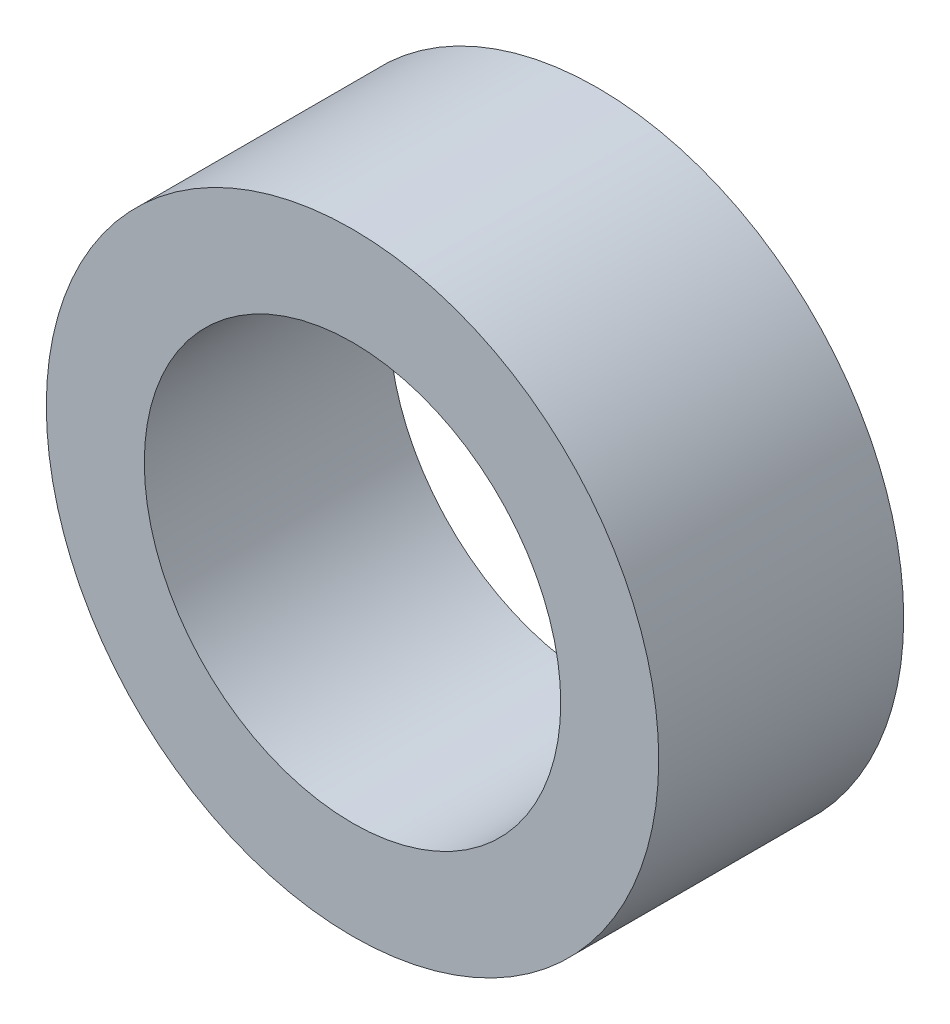
ISO-10303-21;
HEADER;
FILE_DESCRIPTION(('STEP AP214'),'2;1');
FILE_NAME('part.step','',(''),(''),'','','');
FILE_SCHEMA(('AUTOMOTIVE_DESIGN { 1 0 10303 214 1 1 1 1 }'));
ENDSEC;
DATA;
#1=APPLICATION_CONTEXT('core data for automotive mechanical design processes');
#2=APPLICATION_PROTOCOL_DEFINITION('international standard','automotive_design',2000,#1);
#3=PRODUCT_CONTEXT('',#1,'mechanical');
#4=PRODUCT('Part','Part','',(#3));
#5=PRODUCT_RELATED_PRODUCT_CATEGORY('part','',(#4));
#6=PRODUCT_DEFINITION_FORMATION('','',#4);
#7=PRODUCT_DEFINITION_CONTEXT('part definition',#1,'design');
#8=PRODUCT_DEFINITION('design','',#6,#7);
#9=PRODUCT_DEFINITION_SHAPE('','',#8);
#10=(LENGTH_UNIT() NAMED_UNIT(*) SI_UNIT(.MILLI.,.METRE.));
#11=(NAMED_UNIT(*) PLANE_ANGLE_UNIT() SI_UNIT($,.RADIAN.));
#12=(NAMED_UNIT(*) SI_UNIT($,.STERADIAN.) SOLID_ANGLE_UNIT());
#13=UNCERTAINTY_MEASURE_WITH_UNIT(LENGTH_MEASURE(1.E-05),#10,'distance_accuracy_value','');
#14=(GEOMETRIC_REPRESENTATION_CONTEXT(3) GLOBAL_UNCERTAINTY_ASSIGNED_CONTEXT((#13)) GLOBAL_UNIT_ASSIGNED_CONTEXT((#10,
#11,#12)) REPRESENTATION_CONTEXT('',''));
#15=CARTESIAN_POINT('',(0.,0.,0.));
#16=DIRECTION('',(0.,0.,1.));
#17=DIRECTION('',(1.,0.,0.));
#18=AXIS2_PLACEMENT_3D('',#15,#16,#17);
#19=CARTESIAN_POINT('',(0.,0.,2.));
#20=DIRECTION('',(0.,0.,-1.));
#21=DIRECTION('',(-1.,0.,0.));
#22=AXIS2_PLACEMENT_3D('',#19,#20,#21);
#23=CYLINDRICAL_SURFACE('',#22,2.5);
#24=CARTESIAN_POINT('',(0.,0.,2.));
#25=DIRECTION('',(0.,0.,1.));
#26=DIRECTION('',(1.,0.,0.));
#27=AXIS2_PLACEMENT_3D('',#24,#25,#26);
#28=CIRCLE('',#27,2.5);
#29=CARTESIAN_POINT('',(2.5,0.,2.));
#30=VERTEX_POINT('',#29);
#31=EDGE_CURVE('E10',#30,#30,#28,.T.);
#32=ORIENTED_EDGE('',*,*,#31,.F.);
#33=EDGE_LOOP('',(#32));
#34=FACE_BOUND('',#33,.T.);
#35=CARTESIAN_POINT('',(0.,0.,0.));
#36=DIRECTION('',(0.,0.,1.));
#37=DIRECTION('',(1.,0.,0.));
#38=AXIS2_PLACEMENT_3D('',#35,#36,#37);
#39=CIRCLE('',#38,2.5);
#40=CARTESIAN_POINT('',(2.5,0.,0.));
#41=VERTEX_POINT('',#40);
#42=EDGE_CURVE('E52',#41,#41,#39,.T.);
#43=ORIENTED_EDGE('',*,*,#42,.T.);
#44=EDGE_LOOP('',(#43));
#45=FACE_BOUND('',#44,.T.);
#46=ADVANCED_FACE('F43',(#34,#45),#23,.T.);
#47=CARTESIAN_POINT('',(0.,0.,2.));
#48=DIRECTION('',(0.,0.,1.));
#49=DIRECTION('',(1.,0.,0.));
#50=AXIS2_PLACEMENT_3D('',#47,#48,#49);
#51=PLANE('',#50);
#52=CARTESIAN_POINT('',(0.,0.,2.000012));
#53=DIRECTION('',(0.,0.,1.));
#54=DIRECTION('',(1.,0.,0.));
#55=AXIS2_PLACEMENT_3D('',#52,#53,#54);
#56=CIRCLE('',#55,1.7);
#57=CARTESIAN_POINT('',(1.7,0.,2.000012));
#58=VERTEX_POINT('',#57);
#59=EDGE_CURVE('E66',#58,#58,#56,.T.);
#60=ORIENTED_EDGE('',*,*,#59,.F.);
#61=EDGE_LOOP('',(#60));
#62=FACE_BOUND('',#61,.T.);
#63=ORIENTED_EDGE('',*,*,#31,.T.);
#64=EDGE_LOOP('',(#63));
#65=FACE_BOUND('',#64,.T.);
#66=ADVANCED_FACE('F68',(#62,#65),#51,.T.);
#67=CARTESIAN_POINT('',(0.,0.,0.));
#68=DIRECTION('',(0.,0.,1.));
#69=DIRECTION('',(1.,0.,0.));
#70=AXIS2_PLACEMENT_3D('',#67,#68,#69);
#71=PLANE('',#70);
#72=CARTESIAN_POINT('',(0.,0.,0.));
#73=DIRECTION('',(0.,0.,1.));
#74=DIRECTION('',(1.,0.,0.));
#75=AXIS2_PLACEMENT_3D('',#72,#73,#74);
#76=CIRCLE('',#75,1.7);
#77=CARTESIAN_POINT('',(1.7,0.,0.));
#78=VERTEX_POINT('',#77);
#79=EDGE_CURVE('E56',#78,#78,#76,.T.);
#80=ORIENTED_EDGE('',*,*,#79,.T.);
#81=EDGE_LOOP('',(#80));
#82=FACE_BOUND('',#81,.T.);
#83=ORIENTED_EDGE('',*,*,#42,.F.);
#84=EDGE_LOOP('',(#83));
#85=FACE_BOUND('',#84,.T.);
#86=ADVANCED_FACE('F77',(#82,#85),#71,.F.);
#87=CARTESIAN_POINT('',(0.,0.,0.));
#88=DIRECTION('',(0.,0.,1.));
#89=DIRECTION('',(1.,0.,0.));
#90=AXIS2_PLACEMENT_3D('',#87,#88,#89);
#91=CYLINDRICAL_SURFACE('',#90,1.7);
#92=ORIENTED_EDGE('',*,*,#79,.F.);
#93=EDGE_LOOP('',(#92));
#94=FACE_BOUND('',#93,.T.);
#95=ORIENTED_EDGE('',*,*,#59,.T.);
#96=EDGE_LOOP('',(#95));
#97=FACE_BOUND('',#96,.T.);
#98=ADVANCED_FACE('F82',(#94,#97),#91,.F.);
#99=CLOSED_SHELL('',(#46,#66,#86,#98));
#100=MANIFOLD_SOLID_BREP('B2',#99);
#101=ADVANCED_BREP_SHAPE_REPRESENTATION('',(#18,#100),#14);
#102=SHAPE_DEFINITION_REPRESENTATION(#9,#101);
ENDSEC;
END-ISO-10303-21;
